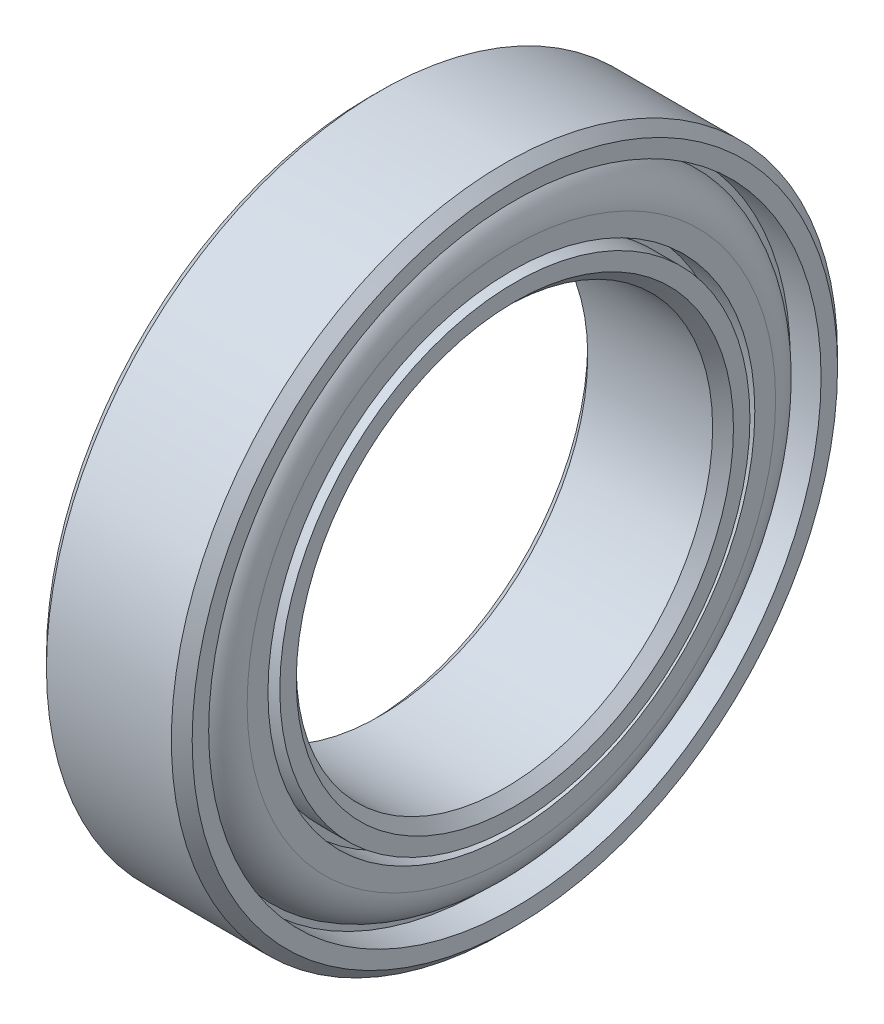
ISO-10303-21;
HEADER;
FILE_DESCRIPTION(('STEP AP214'),'2;1');
FILE_NAME('part.step','',(''),(''),'','','');
FILE_SCHEMA(('AUTOMOTIVE_DESIGN { 1 0 10303 214 1 1 1 1 }'));
ENDSEC;
DATA;
#1=APPLICATION_CONTEXT('core data for automotive mechanical design processes');
#2=APPLICATION_PROTOCOL_DEFINITION('international standard','automotive_design',2000,#1);
#3=PRODUCT_CONTEXT('',#1,'mechanical');
#4=PRODUCT('Part','Part','',(#3));
#5=PRODUCT_RELATED_PRODUCT_CATEGORY('part','',(#4));
#6=PRODUCT_DEFINITION_FORMATION('','',#4);
#7=PRODUCT_DEFINITION_CONTEXT('part definition',#1,'design');
#8=PRODUCT_DEFINITION('design','',#6,#7);
#9=PRODUCT_DEFINITION_SHAPE('','',#8);
#10=(LENGTH_UNIT() NAMED_UNIT(*) SI_UNIT(.MILLI.,.METRE.));
#11=(NAMED_UNIT(*) PLANE_ANGLE_UNIT() SI_UNIT($,.RADIAN.));
#12=(NAMED_UNIT(*) SI_UNIT($,.STERADIAN.) SOLID_ANGLE_UNIT());
#13=UNCERTAINTY_MEASURE_WITH_UNIT(LENGTH_MEASURE(1.E-05),#10,'distance_accuracy_value','');
#14=(GEOMETRIC_REPRESENTATION_CONTEXT(3) GLOBAL_UNCERTAINTY_ASSIGNED_CONTEXT((#13)) GLOBAL_UNIT_ASSIGNED_CONTEXT((#10,
#11,#12)) REPRESENTATION_CONTEXT('',''));
#15=CARTESIAN_POINT('',(0.,0.,0.));
#16=DIRECTION('',(0.,0.,1.));
#17=DIRECTION('',(1.,0.,0.));
#18=AXIS2_PLACEMENT_3D('',#15,#16,#17);
#19=CARTESIAN_POINT('',(3.49999999999999,16.,0.));
#20=DIRECTION('',(1.,0.,0.));
#21=DIRECTION('',(0.,0.,-1.));
#22=AXIS2_PLACEMENT_3D('',#19,#20,#21);
#23=PLANE('',#22);
#24=CARTESIAN_POINT('',(3.49999999999999,0.,0.));
#25=DIRECTION('',(1.,0.,0.));
#26=DIRECTION('',(0.,0.,-1.));
#27=AXIS2_PLACEMENT_3D('',#24,#25,#26);
#28=CIRCLE('',#27,10.5);
#29=CARTESIAN_POINT('',(3.49999999999999,0.,-10.5));
#30=VERTEX_POINT('',#29);
#31=EDGE_CURVE('E10',#30,#30,#28,.F.);
#32=ORIENTED_EDGE('',*,*,#31,.T.);
#33=EDGE_LOOP('',(#32));
#34=FACE_BOUND('',#33,.T.);
#35=CARTESIAN_POINT('',(3.49999999999999,0.,0.));
#36=DIRECTION('',(1.,0.,0.));
#37=DIRECTION('',(0.,0.,-1.));
#38=AXIS2_PLACEMENT_3D('',#35,#36,#37);
#39=CIRCLE('',#38,11.2913185833499);
#40=CARTESIAN_POINT('',(3.49999999999999,0.,-11.2913185833499));
#41=VERTEX_POINT('',#40);
#42=EDGE_CURVE('E75',#41,#41,#39,.T.);
#43=ORIENTED_EDGE('',*,*,#42,.T.);
#44=EDGE_LOOP('',(#43));
#45=FACE_BOUND('',#44,.T.);
#46=ADVANCED_FACE('F33',(#34,#45),#23,.T.);
#47=CARTESIAN_POINT('',(-3.5,16.,0.));
#48=DIRECTION('',(-1.,0.,0.));
#49=DIRECTION('',(0.,0.,1.));
#50=AXIS2_PLACEMENT_3D('',#47,#48,#49);
#51=PLANE('',#50);
#52=CARTESIAN_POINT('',(-3.5,0.,0.));
#53=DIRECTION('',(-1.,0.,0.));
#54=DIRECTION('',(0.,0.,1.));
#55=AXIS2_PLACEMENT_3D('',#52,#53,#54);
#56=CIRCLE('',#55,10.5);
#57=CARTESIAN_POINT('',(-3.5,0.,10.5));
#58=VERTEX_POINT('',#57);
#59=EDGE_CURVE('E63',#58,#58,#56,.F.);
#60=ORIENTED_EDGE('',*,*,#59,.T.);
#61=EDGE_LOOP('',(#60));
#62=FACE_BOUND('',#61,.T.);
#63=CARTESIAN_POINT('',(-3.5,0.,0.));
#64=DIRECTION('',(-1.,0.,0.));
#65=DIRECTION('',(0.,0.,1.));
#66=AXIS2_PLACEMENT_3D('',#63,#64,#65);
#67=CIRCLE('',#66,11.2913185833499);
#68=CARTESIAN_POINT('',(-3.5,0.,11.2913185833499));
#69=VERTEX_POINT('',#68);
#70=EDGE_CURVE('E78',#69,#69,#67,.T.);
#71=ORIENTED_EDGE('',*,*,#70,.T.);
#72=EDGE_LOOP('',(#71));
#73=FACE_BOUND('',#72,.T.);
#74=ADVANCED_FACE('F133',(#62,#73),#51,.T.);
#75=CARTESIAN_POINT('',(0.,0.,0.));
#76=DIRECTION('',(1.,0.,0.));
#77=DIRECTION('',(0.,0.,-1.));
#78=AXIS2_PLACEMENT_3D('',#75,#76,#77);
#79=CYLINDRICAL_SURFACE('',#78,10.);
#80=CARTESIAN_POINT('',(-3.,0.,0.));
#81=DIRECTION('',(-1.,0.,0.));
#82=DIRECTION('',(0.,0.,1.));
#83=AXIS2_PLACEMENT_3D('',#80,#81,#82);
#84=CIRCLE('',#83,10.);
#85=CARTESIAN_POINT('',(-3.,0.,10.));
#86=VERTEX_POINT('',#85);
#87=EDGE_CURVE('E57',#86,#86,#84,.T.);
#88=ORIENTED_EDGE('',*,*,#87,.T.);
#89=EDGE_LOOP('',(#88));
#90=FACE_BOUND('',#89,.T.);
#91=CARTESIAN_POINT('',(2.99999999999999,0.,0.));
#92=DIRECTION('',(1.,0.,0.));
#93=DIRECTION('',(0.,0.,-1.));
#94=AXIS2_PLACEMENT_3D('',#91,#92,#93);
#95=CIRCLE('',#94,10.);
#96=CARTESIAN_POINT('',(2.99999999999999,0.,-10.));
#97=VERTEX_POINT('',#96);
#98=EDGE_CURVE('E60',#97,#97,#95,.T.);
#99=ORIENTED_EDGE('',*,*,#98,.T.);
#100=EDGE_LOOP('',(#99));
#101=FACE_BOUND('',#100,.T.);
#102=ADVANCED_FACE('F137',(#90,#101),#79,.F.);
#103=CARTESIAN_POINT('',(-2.022867053245,14.707924857567,0.));
#104=DIRECTION('',(-1.,0.,0.));
#105=DIRECTION('',(0.,0.,1.));
#106=AXIS2_PLACEMENT_3D('',#103,#104,#105);
#107=PLANE('',#106);
#108=CARTESIAN_POINT('',(-2.022867053245,0.,0.));
#109=DIRECTION('',(-1.,0.,0.));
#110=DIRECTION('',(0.,0.,1.));
#111=AXIS2_PLACEMENT_3D('',#108,#109,#110);
#112=CIRCLE('',#111,14.707924857567);
#113=CARTESIAN_POINT('',(-2.022867053245,0.,14.707924857567));
#114=VERTEX_POINT('',#113);
#115=EDGE_CURVE('E98',#114,#114,#112,.T.);
#116=ORIENTED_EDGE('',*,*,#115,.T.);
#117=EDGE_LOOP('',(#116));
#118=FACE_BOUND('',#117,.T.);
#119=CARTESIAN_POINT('',(-2.022867053245,0.,0.));
#120=DIRECTION('',(-1.,0.,0.));
#121=DIRECTION('',(0.,0.,1.));
#122=AXIS2_PLACEMENT_3D('',#119,#120,#121);
#123=CIRCLE('',#122,14.4240291478726);
#124=CARTESIAN_POINT('',(-2.022867053245,0.,14.4240291478726));
#125=VERTEX_POINT('',#124);
#126=EDGE_CURVE('E85',#125,#125,#123,.T.);
#127=ORIENTED_EDGE('',*,*,#126,.F.);
#128=EDGE_LOOP('',(#127));
#129=FACE_BOUND('',#128,.T.);
#130=ADVANCED_FACE('F192',(#118,#129),#107,.T.);
#131=CARTESIAN_POINT('',(-3.33242936631428,14.4240291478726,0.));
#132=DIRECTION('',(-1.,0.,0.));
#133=DIRECTION('',(0.,0.,1.));
#134=AXIS2_PLACEMENT_3D('',#131,#132,#133);
#135=PLANE('',#134);
#136=CARTESIAN_POINT('',(-3.33242936631428,0.,0.));
#137=DIRECTION('',(-1.,0.,0.));
#138=DIRECTION('',(0.,0.,1.));
#139=AXIS2_PLACEMENT_3D('',#136,#137,#138);
#140=CIRCLE('',#139,12.6921310922013);
#141=CARTESIAN_POINT('',(-3.33242936631428,0.,12.6921310922013));
#142=VERTEX_POINT('',#141);
#143=EDGE_CURVE('E69',#142,#142,#140,.T.);
#144=ORIENTED_EDGE('',*,*,#143,.T.);
#145=EDGE_LOOP('',(#144));
#146=FACE_BOUND('',#145,.T.);
#147=CARTESIAN_POINT('',(-3.33242936631428,0.,0.));
#148=DIRECTION('',(-1.,0.,0.));
#149=DIRECTION('',(0.,0.,1.));
#150=AXIS2_PLACEMENT_3D('',#147,#148,#149);
#151=CIRCLE('',#150,11.692719364305);
#152=CARTESIAN_POINT('',(-3.33242936631428,0.,11.692719364305));
#153=VERTEX_POINT('',#152);
#154=EDGE_CURVE('E89',#153,#153,#151,.T.);
#155=ORIENTED_EDGE('',*,*,#154,.F.);
#156=EDGE_LOOP('',(#155));
#157=FACE_BOUND('',#156,.T.);
#158=ADVANCED_FACE('F196',(#146,#157),#135,.T.);
#159=CARTESIAN_POINT('',(0.,0.,0.));
#160=DIRECTION('',(-1.,0.,0.));
#161=DIRECTION('',(0.,0.,1.));
#162=AXIS2_PLACEMENT_3D('',#159,#160,#161);
#163=CYLINDRICAL_SURFACE('',#162,11.692719364305);
#164=ORIENTED_EDGE('',*,*,#154,.T.);
#165=EDGE_LOOP('',(#164));
#166=FACE_BOUND('',#165,.T.);
#167=CARTESIAN_POINT('',(-2.022867053245,0.,0.));
#168=DIRECTION('',(-1.,0.,0.));
#169=DIRECTION('',(0.,0.,1.));
#170=AXIS2_PLACEMENT_3D('',#167,#168,#169);
#171=CIRCLE('',#170,11.692719364305);
#172=CARTESIAN_POINT('',(-2.022867053245,0.,11.692719364305));
#173=VERTEX_POINT('',#172);
#174=EDGE_CURVE('E92',#173,#173,#171,.T.);
#175=ORIENTED_EDGE('',*,*,#174,.F.);
#176=EDGE_LOOP('',(#175));
#177=FACE_BOUND('',#176,.T.);
#178=ADVANCED_FACE('F200',(#166,#177),#163,.F.);
#179=CARTESIAN_POINT('',(-2.022867053245,11.692719364305,0.));
#180=DIRECTION('',(-1.,0.,0.));
#181=DIRECTION('',(0.,0.,1.));
#182=AXIS2_PLACEMENT_3D('',#179,#180,#181);
#183=PLANE('',#182);
#184=ORIENTED_EDGE('',*,*,#174,.T.);
#185=EDGE_LOOP('',(#184));
#186=FACE_BOUND('',#185,.T.);
#187=CARTESIAN_POINT('',(-2.022867053245,0.,0.));
#188=DIRECTION('',(-1.,0.,0.));
#189=DIRECTION('',(0.,0.,1.));
#190=AXIS2_PLACEMENT_3D('',#187,#188,#189);
#191=CIRCLE('',#190,11.2913185833499);
#192=CARTESIAN_POINT('',(-2.022867053245,0.,11.2913185833499));
#193=VERTEX_POINT('',#192);
#194=EDGE_CURVE('E95',#193,#193,#191,.T.);
#195=ORIENTED_EDGE('',*,*,#194,.F.);
#196=EDGE_LOOP('',(#195));
#197=FACE_BOUND('',#196,.T.);
#198=ADVANCED_FACE('F204',(#186,#197),#183,.T.);
#199=CARTESIAN_POINT('',(0.,0.,0.));
#200=DIRECTION('',(-1.,0.,0.));
#201=DIRECTION('',(0.,0.,1.));
#202=AXIS2_PLACEMENT_3D('',#199,#200,#201);
#203=CYLINDRICAL_SURFACE('',#202,11.2913185833499);
#204=ORIENTED_EDGE('',*,*,#70,.F.);
#205=EDGE_LOOP('',(#204));
#206=FACE_BOUND('',#205,.T.);
#207=ORIENTED_EDGE('',*,*,#194,.T.);
#208=EDGE_LOOP('',(#207));
#209=FACE_BOUND('',#208,.T.);
#210=ADVANCED_FACE('F208',(#206,#209),#203,.T.);
#211=CARTESIAN_POINT('',(0.,0.,0.));
#212=DIRECTION('',(-1.,0.,0.));
#213=DIRECTION('',(0.,0.,1.));
#214=AXIS2_PLACEMENT_3D('',#211,#212,#213);
#215=CYLINDRICAL_SURFACE('',#214,14.707924857567);
#216=CARTESIAN_POINT('',(-3.5,0.,0.));
#217=DIRECTION('',(-1.,0.,0.));
#218=DIRECTION('',(0.,0.,1.));
#219=AXIS2_PLACEMENT_3D('',#216,#217,#218);
#220=CIRCLE('',#219,14.707924857567);
#221=CARTESIAN_POINT('',(-3.5,0.,14.707924857567));
#222=VERTEX_POINT('',#221);
#223=EDGE_CURVE('E81',#222,#222,#220,.F.);
#224=ORIENTED_EDGE('',*,*,#223,.F.);
#225=EDGE_LOOP('',(#224));
#226=FACE_BOUND('',#225,.T.);
#227=ORIENTED_EDGE('',*,*,#115,.F.);
#228=EDGE_LOOP('',(#227));
#229=FACE_BOUND('',#228,.T.);
#230=ADVANCED_FACE('F212',(#226,#229),#215,.F.);
#231=CARTESIAN_POINT('',(0.,0.,0.));
#232=DIRECTION('',(-1.,0.,0.));
#233=DIRECTION('',(0.,0.,1.));
#234=AXIS2_PLACEMENT_3D('',#231,#232,#233);
#235=CYLINDRICAL_SURFACE('',#234,14.707924857567);
#236=CARTESIAN_POINT('',(3.49999999999999,0.,0.));
#237=DIRECTION('',(1.,0.,0.));
#238=DIRECTION('',(0.,0.,-1.));
#239=AXIS2_PLACEMENT_3D('',#236,#237,#238);
#240=CIRCLE('',#239,14.707924857567);
#241=CARTESIAN_POINT('',(3.49999999999999,0.,-14.707924857567));
#242=VERTEX_POINT('',#241);
#243=EDGE_CURVE('E72',#242,#242,#240,.F.);
#244=ORIENTED_EDGE('',*,*,#243,.F.);
#245=EDGE_LOOP('',(#244));
#246=FACE_BOUND('',#245,.T.);
#247=CARTESIAN_POINT('',(2.02286705324499,0.,0.));
#248=DIRECTION('',(-1.,0.,0.));
#249=DIRECTION('',(0.,0.,1.));
#250=AXIS2_PLACEMENT_3D('',#247,#248,#249);
#251=CIRCLE('',#250,14.707924857567);
#252=CARTESIAN_POINT('',(2.02286705324499,0.,14.707924857567));
#253=VERTEX_POINT('',#252);
#254=EDGE_CURVE('E84',#253,#253,#251,.T.);
#255=ORIENTED_EDGE('',*,*,#254,.T.);
#256=EDGE_LOOP('',(#255));
#257=FACE_BOUND('',#256,.T.);
#258=ADVANCED_FACE('F216',(#246,#257),#235,.F.);
#259=CARTESIAN_POINT('',(2.02286705324499,14.707924857567,0.));
#260=DIRECTION('',(1.,0.,0.));
#261=DIRECTION('',(0.,0.,-1.));
#262=AXIS2_PLACEMENT_3D('',#259,#260,#261);
#263=PLANE('',#262);
#264=CARTESIAN_POINT('',(2.02286705324499,0.,0.));
#265=DIRECTION('',(-1.,0.,0.));
#266=DIRECTION('',(0.,0.,1.));
#267=AXIS2_PLACEMENT_3D('',#264,#265,#266);
#268=CIRCLE('',#267,14.4240291478726);
#269=CARTESIAN_POINT('',(2.02286705324499,0.,14.4240291478726));
#270=VERTEX_POINT('',#269);
#271=EDGE_CURVE('E103',#270,#270,#268,.T.);
#272=ORIENTED_EDGE('',*,*,#271,.T.);
#273=EDGE_LOOP('',(#272));
#274=FACE_BOUND('',#273,.T.);
#275=ORIENTED_EDGE('',*,*,#254,.F.);
#276=EDGE_LOOP('',(#275));
#277=FACE_BOUND('',#276,.T.);
#278=ADVANCED_FACE('F220',(#274,#277),#263,.T.);
#279=CARTESIAN_POINT('',(3.33242936631427,14.4240291478726,0.));
#280=DIRECTION('',(1.,0.,0.));
#281=DIRECTION('',(0.,0.,-1.));
#282=AXIS2_PLACEMENT_3D('',#279,#280,#281);
#283=PLANE('',#282);
#284=CARTESIAN_POINT('',(3.33242936631427,0.,0.));
#285=DIRECTION('',(1.,0.,0.));
#286=DIRECTION('',(0.,0.,-1.));
#287=AXIS2_PLACEMENT_3D('',#284,#285,#286);
#288=CIRCLE('',#287,12.6921310922013);
#289=CARTESIAN_POINT('',(3.33242936631427,0.,-12.6921310922013));
#290=VERTEX_POINT('',#289);
#291=EDGE_CURVE('E66',#290,#290,#288,.T.);
#292=ORIENTED_EDGE('',*,*,#291,.T.);
#293=EDGE_LOOP('',(#292));
#294=FACE_BOUND('',#293,.T.);
#295=CARTESIAN_POINT('',(3.33242936631427,0.,0.));
#296=DIRECTION('',(-1.,0.,0.));
#297=DIRECTION('',(0.,0.,1.));
#298=AXIS2_PLACEMENT_3D('',#295,#296,#297);
#299=CIRCLE('',#298,11.692719364305);
#300=CARTESIAN_POINT('',(3.33242936631427,0.,11.692719364305));
#301=VERTEX_POINT('',#300);
#302=EDGE_CURVE('E106',#301,#301,#299,.T.);
#303=ORIENTED_EDGE('',*,*,#302,.T.);
#304=EDGE_LOOP('',(#303));
#305=FACE_BOUND('',#304,.T.);
#306=ADVANCED_FACE('F224',(#294,#305),#283,.T.);
#307=CARTESIAN_POINT('',(0.,0.,0.));
#308=DIRECTION('',(-1.,0.,0.));
#309=DIRECTION('',(0.,0.,1.));
#310=AXIS2_PLACEMENT_3D('',#307,#308,#309);
#311=CYLINDRICAL_SURFACE('',#310,11.692719364305);
#312=CARTESIAN_POINT('',(2.02286705324499,0.,0.));
#313=DIRECTION('',(-1.,0.,0.));
#314=DIRECTION('',(0.,0.,1.));
#315=AXIS2_PLACEMENT_3D('',#312,#313,#314);
#316=CIRCLE('',#315,11.692719364305);
#317=CARTESIAN_POINT('',(2.02286705324499,0.,11.692719364305));
#318=VERTEX_POINT('',#317);
#319=EDGE_CURVE('E109',#318,#318,#316,.T.);
#320=ORIENTED_EDGE('',*,*,#319,.T.);
#321=EDGE_LOOP('',(#320));
#322=FACE_BOUND('',#321,.T.);
#323=ORIENTED_EDGE('',*,*,#302,.F.);
#324=EDGE_LOOP('',(#323));
#325=FACE_BOUND('',#324,.T.);
#326=ADVANCED_FACE('F129',(#322,#325),#311,.F.);
#327=CARTESIAN_POINT('',(2.02286705324499,11.692719364305,0.));
#328=DIRECTION('',(1.,0.,0.));
#329=DIRECTION('',(0.,0.,-1.));
#330=AXIS2_PLACEMENT_3D('',#327,#328,#329);
#331=PLANE('',#330);
#332=CARTESIAN_POINT('',(2.02286705324499,0.,0.));
#333=DIRECTION('',(-1.,0.,0.));
#334=DIRECTION('',(0.,0.,1.));
#335=AXIS2_PLACEMENT_3D('',#332,#333,#334);
#336=CIRCLE('',#335,11.2913185833499);
#337=CARTESIAN_POINT('',(2.02286705324499,0.,11.2913185833499));
#338=VERTEX_POINT('',#337);
#339=EDGE_CURVE('E88',#338,#338,#336,.T.);
#340=ORIENTED_EDGE('',*,*,#339,.T.);
#341=EDGE_LOOP('',(#340));
#342=FACE_BOUND('',#341,.T.);
#343=ORIENTED_EDGE('',*,*,#319,.F.);
#344=EDGE_LOOP('',(#343));
#345=FACE_BOUND('',#344,.T.);
#346=ADVANCED_FACE('F115',(#342,#345),#331,.T.);
#347=CARTESIAN_POINT('',(0.,0.,0.));
#348=DIRECTION('',(-1.,0.,0.));
#349=DIRECTION('',(0.,0.,1.));
#350=AXIS2_PLACEMENT_3D('',#347,#348,#349);
#351=CYLINDRICAL_SURFACE('',#350,11.2913185833499);
#352=ORIENTED_EDGE('',*,*,#42,.F.);
#353=EDGE_LOOP('',(#352));
#354=FACE_BOUND('',#353,.T.);
#355=ORIENTED_EDGE('',*,*,#339,.F.);
#356=EDGE_LOOP('',(#355));
#357=FACE_BOUND('',#356,.T.);
#358=ADVANCED_FACE('F118',(#354,#357),#351,.T.);
#359=CARTESIAN_POINT('',(3.49999999999999,0.,0.));
#360=DIRECTION('',(1.,0.,0.));
#361=DIRECTION('',(0.,0.,-1.));
#362=AXIS2_PLACEMENT_3D('',#359,#360,#361);
#363=CIRCLE('',#362,15.5);
#364=CARTESIAN_POINT('',(3.49999999999999,0.,-15.5));
#365=VERTEX_POINT('',#364);
#366=EDGE_CURVE('E41',#365,#365,#363,.T.);
#367=ORIENTED_EDGE('',*,*,#366,.T.);
#368=EDGE_LOOP('',(#367));
#369=FACE_BOUND('',#368,.T.);
#370=ORIENTED_EDGE('',*,*,#243,.T.);
#371=EDGE_LOOP('',(#370));
#372=FACE_BOUND('',#371,.T.);
#373=ADVANCED_FACE('F120',(#369,#372),#23,.T.);
#374=CARTESIAN_POINT('',(0.,0.,0.));
#375=DIRECTION('',(1.,0.,0.));
#376=DIRECTION('',(0.,0.,-1.));
#377=AXIS2_PLACEMENT_3D('',#374,#375,#376);
#378=CYLINDRICAL_SURFACE('',#377,16.);
#379=CARTESIAN_POINT('',(-3.00000000000001,0.,0.));
#380=DIRECTION('',(-1.,0.,0.));
#381=DIRECTION('',(0.,0.,1.));
#382=AXIS2_PLACEMENT_3D('',#379,#380,#381);
#383=CIRCLE('',#382,16.);
#384=CARTESIAN_POINT('',(-3.00000000000001,0.,16.));
#385=VERTEX_POINT('',#384);
#386=EDGE_CURVE('E49',#385,#385,#383,.F.);
#387=ORIENTED_EDGE('',*,*,#386,.T.);
#388=EDGE_LOOP('',(#387));
#389=FACE_BOUND('',#388,.T.);
#390=CARTESIAN_POINT('',(2.99999999999999,0.,0.));
#391=DIRECTION('',(1.,0.,0.));
#392=DIRECTION('',(0.,0.,-1.));
#393=AXIS2_PLACEMENT_3D('',#390,#391,#392);
#394=CIRCLE('',#393,16.);
#395=CARTESIAN_POINT('',(2.99999999999999,0.,-16.));
#396=VERTEX_POINT('',#395);
#397=EDGE_CURVE('E54',#396,#396,#394,.F.);
#398=ORIENTED_EDGE('',*,*,#397,.T.);
#399=EDGE_LOOP('',(#398));
#400=FACE_BOUND('',#399,.T.);
#401=ADVANCED_FACE('F127',(#389,#400),#378,.T.);
#402=CARTESIAN_POINT('',(-3.5,0.,0.));
#403=DIRECTION('',(-1.,0.,0.));
#404=DIRECTION('',(0.,0.,1.));
#405=AXIS2_PLACEMENT_3D('',#402,#403,#404);
#406=CIRCLE('',#405,15.5);
#407=CARTESIAN_POINT('',(-3.5,0.,15.5));
#408=VERTEX_POINT('',#407);
#409=EDGE_CURVE('E45',#408,#408,#406,.T.);
#410=ORIENTED_EDGE('',*,*,#409,.T.);
#411=EDGE_LOOP('',(#410));
#412=FACE_BOUND('',#411,.T.);
#413=ORIENTED_EDGE('',*,*,#223,.T.);
#414=EDGE_LOOP('',(#413));
#415=FACE_BOUND('',#414,.T.);
#416=ADVANCED_FACE('F140',(#412,#415),#51,.T.);
#417=CARTESIAN_POINT('',(-1.53242936631428,0.,0.));
#418=DIRECTION('',(1.,0.,0.));
#419=DIRECTION('',(0.,0.,-1.));
#420=AXIS2_PLACEMENT_3D('',#417,#418,#419);
#421=TOROIDAL_SURFACE('',#420,12.6921310922013,1.8);
#422=ORIENTED_EDGE('',*,*,#126,.T.);
#423=EDGE_LOOP('',(#422));
#424=FACE_BOUND('',#423,.T.);
#425=ORIENTED_EDGE('',*,*,#143,.F.);
#426=EDGE_LOOP('',(#425));
#427=FACE_BOUND('',#426,.T.);
#428=ADVANCED_FACE('F144',(#424,#427),#421,.T.);
#429=CARTESIAN_POINT('',(1.53242936631427,0.,0.));
#430=DIRECTION('',(-1.,0.,0.));
#431=DIRECTION('',(0.,0.,1.));
#432=AXIS2_PLACEMENT_3D('',#429,#430,#431);
#433=TOROIDAL_SURFACE('',#432,12.6921310922013,1.8);
#434=ORIENTED_EDGE('',*,*,#291,.F.);
#435=EDGE_LOOP('',(#434));
#436=FACE_BOUND('',#435,.T.);
#437=ORIENTED_EDGE('',*,*,#271,.F.);
#438=EDGE_LOOP('',(#437));
#439=FACE_BOUND('',#438,.T.);
#440=ADVANCED_FACE('F147',(#436,#439),#433,.T.);
#441=CARTESIAN_POINT('',(-3.5,0.,0.));
#442=DIRECTION('',(-1.,0.,0.));
#443=DIRECTION('',(0.,0.,1.));
#444=AXIS2_PLACEMENT_3D('',#441,#442,#443);
#445=CONICAL_SURFACE('',#444,10.5,0.785398163397441);
#446=ORIENTED_EDGE('',*,*,#87,.F.);
#447=EDGE_LOOP('',(#446));
#448=FACE_BOUND('',#447,.T.);
#449=ORIENTED_EDGE('',*,*,#59,.F.);
#450=EDGE_LOOP('',(#449));
#451=FACE_BOUND('',#450,.T.);
#452=ADVANCED_FACE('F151',(#448,#451),#445,.F.);
#453=CARTESIAN_POINT('',(-3.00000000000001,0.,0.));
#454=DIRECTION('',(1.,0.,0.));
#455=DIRECTION('',(0.,0.,-1.));
#456=AXIS2_PLACEMENT_3D('',#453,#454,#455);
#457=CONICAL_SURFACE('',#456,16.,0.785398163397452);
#458=ORIENTED_EDGE('',*,*,#409,.F.);
#459=EDGE_LOOP('',(#458));
#460=FACE_BOUND('',#459,.T.);
#461=ORIENTED_EDGE('',*,*,#386,.F.);
#462=EDGE_LOOP('',(#461));
#463=FACE_BOUND('',#462,.T.);
#464=ADVANCED_FACE('F159',(#460,#463),#457,.T.);
#465=CARTESIAN_POINT('',(3.49999999999999,0.,0.));
#466=DIRECTION('',(-1.,0.,0.));
#467=DIRECTION('',(0.,0.,1.));
#468=AXIS2_PLACEMENT_3D('',#465,#466,#467);
#469=CONICAL_SURFACE('',#468,15.5,0.785398163397441);
#470=ORIENTED_EDGE('',*,*,#397,.F.);
#471=EDGE_LOOP('',(#470));
#472=FACE_BOUND('',#471,.T.);
#473=ORIENTED_EDGE('',*,*,#366,.F.);
#474=EDGE_LOOP('',(#473));
#475=FACE_BOUND('',#474,.T.);
#476=ADVANCED_FACE('F165',(#472,#475),#469,.T.);
#477=CARTESIAN_POINT('',(2.99999999999999,0.,0.));
#478=DIRECTION('',(1.,0.,0.));
#479=DIRECTION('',(0.,0.,-1.));
#480=AXIS2_PLACEMENT_3D('',#477,#478,#479);
#481=CONICAL_SURFACE('',#480,10.,0.785398163397448);
#482=ORIENTED_EDGE('',*,*,#31,.F.);
#483=EDGE_LOOP('',(#482));
#484=FACE_BOUND('',#483,.T.);
#485=ORIENTED_EDGE('',*,*,#98,.F.);
#486=EDGE_LOOP('',(#485));
#487=FACE_BOUND('',#486,.T.);
#488=ADVANCED_FACE('F36',(#484,#487),#481,.F.);
#489=CLOSED_SHELL('',(#46,#74,#102,#130,#158,#178,#198,#210,#230,#258,#278,#306,#326,#346,#358,
#373,#401,#416,#428,#440,#452,#464,#476,#488));
#490=MANIFOLD_SOLID_BREP('B2',#489);
#491=ADVANCED_BREP_SHAPE_REPRESENTATION('',(#18,#490),#14);
#492=SHAPE_DEFINITION_REPRESENTATION(#9,#491);
ENDSEC;
END-ISO-10303-21;
